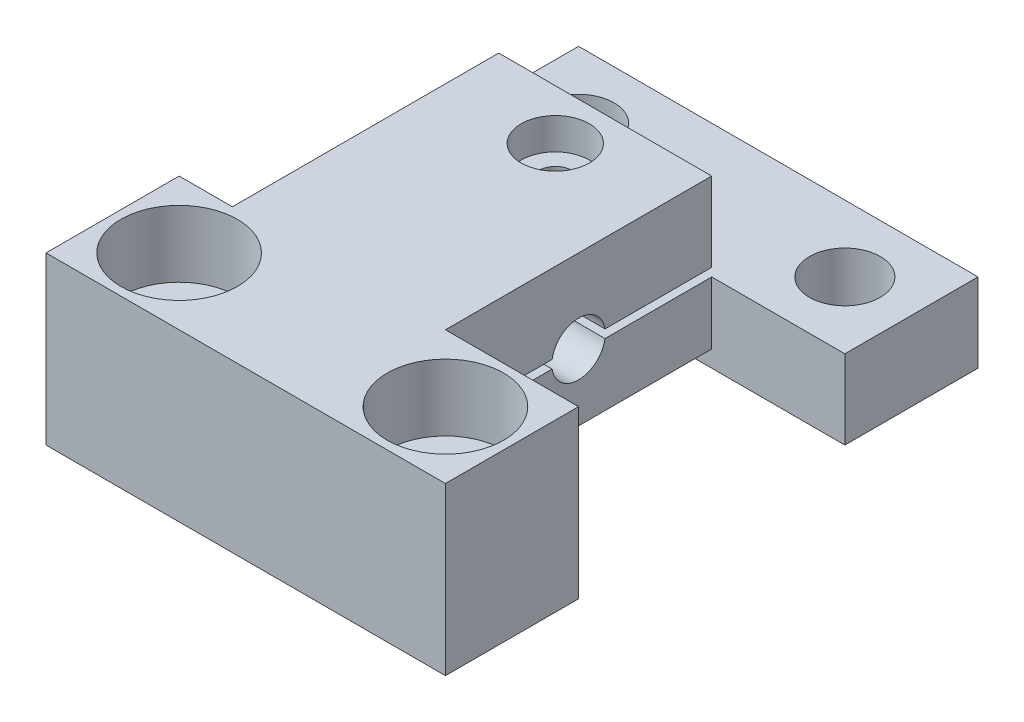
ISO-10303-21;
HEADER;
FILE_DESCRIPTION(('STEP AP214'),'2;1');
FILE_NAME('part.step','',(''),(''),'','','');
FILE_SCHEMA(('AUTOMOTIVE_DESIGN { 1 0 10303 214 1 1 1 1 }'));
ENDSEC;
DATA;
#1=APPLICATION_CONTEXT('core data for automotive mechanical design processes');
#2=APPLICATION_PROTOCOL_DEFINITION('international standard','automotive_design',2000,#1);
#3=PRODUCT_CONTEXT('',#1,'mechanical');
#4=PRODUCT('Part','Part','',(#3));
#5=PRODUCT_RELATED_PRODUCT_CATEGORY('part','',(#4));
#6=PRODUCT_DEFINITION_FORMATION('','',#4);
#7=PRODUCT_DEFINITION_CONTEXT('part definition',#1,'design');
#8=PRODUCT_DEFINITION('design','',#6,#7);
#9=PRODUCT_DEFINITION_SHAPE('','',#8);
#10=(LENGTH_UNIT() NAMED_UNIT(*) SI_UNIT(.MILLI.,.METRE.));
#11=(NAMED_UNIT(*) PLANE_ANGLE_UNIT() SI_UNIT($,.RADIAN.));
#12=(NAMED_UNIT(*) SI_UNIT($,.STERADIAN.) SOLID_ANGLE_UNIT());
#13=UNCERTAINTY_MEASURE_WITH_UNIT(LENGTH_MEASURE(1.E-05),#10,'distance_accuracy_value','');
#14=(GEOMETRIC_REPRESENTATION_CONTEXT(3) GLOBAL_UNCERTAINTY_ASSIGNED_CONTEXT((#13)) GLOBAL_UNIT_ASSIGNED_CONTEXT((#10,
#11,#12)) REPRESENTATION_CONTEXT('',''));
#15=CARTESIAN_POINT('',(0.,0.,0.));
#16=DIRECTION('',(0.,0.,1.));
#17=DIRECTION('',(1.,0.,0.));
#18=AXIS2_PLACEMENT_3D('',#15,#16,#17);
#19=CARTESIAN_POINT('',(-13.97,0.,-12.7));
#20=DIRECTION('',(1.,0.,0.));
#21=DIRECTION('',(0.,0.,-1.));
#22=AXIS2_PLACEMENT_3D('',#19,#20,#21);
#23=PLANE('',#22);
#24=DIRECTION('',(0.,0.,1.));
#25=VECTOR('',#24,1.);
#26=CARTESIAN_POINT('',(-13.97,7.540625,-12.7));
#27=LINE('',#26,#25);
#28=CARTESIAN_POINT('',(-13.97,7.540625,-12.7));
#29=VERTEX_POINT('',#28);
#30=CARTESIAN_POINT('',(-13.97,7.540625,-2.52165967655727));
#31=VERTEX_POINT('',#30);
#32=EDGE_CURVE('E66',#29,#31,#27,.T.);
#33=ORIENTED_EDGE('',*,*,#32,.F.);
#34=DIRECTION('',(0.,1.,0.));
#35=VECTOR('',#34,1.);
#36=CARTESIAN_POINT('',(-13.97,0.,-12.7));
#37=LINE('',#36,#35);
#38=CARTESIAN_POINT('',(-13.97,1.5875,-12.7));
#39=VERTEX_POINT('',#38);
#40=EDGE_CURVE('E372',#39,#29,#37,.T.);
#41=ORIENTED_EDGE('',*,*,#40,.F.);
#42=DIRECTION('',(0.,0.,-1.));
#43=VECTOR('',#42,1.);
#44=CARTESIAN_POINT('',(-13.97,1.5875,12.7));
#45=LINE('',#44,#43);
#46=CARTESIAN_POINT('',(-13.97,1.5875,12.7));
#47=VERTEX_POINT('',#46);
#48=EDGE_CURVE('E317',#47,#39,#45,.T.);
#49=ORIENTED_EDGE('',*,*,#48,.F.);
#50=DIRECTION('',(0.,1.,0.));
#51=VECTOR('',#50,1.);
#52=CARTESIAN_POINT('',(-13.97,0.,12.7));
#53=LINE('',#52,#51);
#54=CARTESIAN_POINT('',(-13.97,15.875,12.7));
#55=VERTEX_POINT('',#54);
#56=EDGE_CURVE('E377',#47,#55,#53,.T.);
#57=ORIENTED_EDGE('',*,*,#56,.T.);
#58=DIRECTION('',(0.,0.,-1.));
#59=VECTOR('',#58,1.);
#60=CARTESIAN_POINT('',(-13.97,15.875,-12.7));
#61=LINE('',#60,#59);
#62=CARTESIAN_POINT('',(-13.97,15.875,-12.7));
#63=VERTEX_POINT('',#62);
#64=EDGE_CURVE('E358',#55,#63,#61,.T.);
#65=ORIENTED_EDGE('',*,*,#64,.T.);
#66=CARTESIAN_POINT('',(-13.97,8.33437499999999,-12.7));
#67=VERTEX_POINT('',#66);
#68=EDGE_CURVE('E376',#67,#63,#37,.T.);
#69=ORIENTED_EDGE('',*,*,#68,.F.);
#70=DIRECTION('',(0.,0.,1.));
#71=VECTOR('',#70,1.);
#72=CARTESIAN_POINT('',(-13.97,8.33437499999999,-12.7));
#73=LINE('',#72,#71);
#74=CARTESIAN_POINT('',(-13.97,8.334375,-2.52165967655728));
#75=VERTEX_POINT('',#74);
#76=EDGE_CURVE('E284',#67,#75,#73,.T.);
#77=ORIENTED_EDGE('',*,*,#76,.T.);
#78=CARTESIAN_POINT('',(-13.97,7.9375,0.));
#79=DIRECTION('',(-1.,0.,0.));
#80=DIRECTION('',(0.,0.,1.));
#81=AXIS2_PLACEMENT_3D('',#78,#79,#80);
#82=CIRCLE('',#81,2.55269999999999);
#83=CARTESIAN_POINT('',(-13.97,8.334375,2.52165967655727));
#84=VERTEX_POINT('',#83);
#85=EDGE_CURVE('E308',#84,#75,#82,.T.);
#86=ORIENTED_EDGE('',*,*,#85,.F.);
#87=CARTESIAN_POINT('',(-13.97,8.334375,6.35));
#88=VERTEX_POINT('',#87);
#89=EDGE_CURVE('E280',#84,#88,#73,.T.);
#90=ORIENTED_EDGE('',*,*,#89,.T.);
#91=DIRECTION('',(0.,1.,0.));
#92=VECTOR('',#91,1.);
#93=CARTESIAN_POINT('',(-13.97,0.,6.35));
#94=LINE('',#93,#92);
#95=CARTESIAN_POINT('',(-13.97,7.540625,6.35));
#96=VERTEX_POINT('',#95);
#97=EDGE_CURVE('E304',#96,#88,#94,.T.);
#98=ORIENTED_EDGE('',*,*,#97,.F.);
#99=CARTESIAN_POINT('',(-13.97,7.540625,2.52165967655728));
#100=VERTEX_POINT('',#99);
#101=EDGE_CURVE('E288',#100,#96,#27,.T.);
#102=ORIENTED_EDGE('',*,*,#101,.F.);
#103=EDGE_CURVE('E307',#31,#100,#82,.T.);
#104=ORIENTED_EDGE('',*,*,#103,.F.);
#105=EDGE_LOOP('',(#33,#41,#49,#57,#65,#69,#77,#86,#90,#98,#102,#104));
#106=FACE_BOUND('',#105,.T.);
#107=ADVANCED_FACE('F40',(#106),#23,.F.);
#108=CARTESIAN_POINT('',(6.35,0.,-12.7));
#109=DIRECTION('',(-1.,0.,0.));
#110=DIRECTION('',(0.,0.,1.));
#111=AXIS2_PLACEMENT_3D('',#108,#109,#110);
#112=PLANE('',#111);
#113=DIRECTION('',(0.,0.,-1.));
#114=VECTOR('',#113,1.);
#115=CARTESIAN_POINT('',(6.35,7.540625,-12.7));
#116=LINE('',#115,#114);
#117=CARTESIAN_POINT('',(6.35,7.540625,-2.52165967655728));
#118=VERTEX_POINT('',#117);
#119=CARTESIAN_POINT('',(6.35,7.540625,-12.7));
#120=VERTEX_POINT('',#119);
#121=EDGE_CURVE('E289',#118,#120,#116,.T.);
#122=ORIENTED_EDGE('',*,*,#121,.F.);
#123=CARTESIAN_POINT('',(6.35,7.9375,0.));
#124=DIRECTION('',(-1.,0.,0.));
#125=DIRECTION('',(0.,0.,1.));
#126=AXIS2_PLACEMENT_3D('',#123,#124,#125);
#127=CIRCLE('',#126,2.55269999999999);
#128=CARTESIAN_POINT('',(6.35,7.540625,2.52165967655727));
#129=VERTEX_POINT('',#128);
#130=EDGE_CURVE('E312',#118,#129,#127,.T.);
#131=ORIENTED_EDGE('',*,*,#130,.T.);
#132=CARTESIAN_POINT('',(6.35,7.540625,6.35));
#133=VERTEX_POINT('',#132);
#134=EDGE_CURVE('E285',#133,#129,#116,.T.);
#135=ORIENTED_EDGE('',*,*,#134,.F.);
#136=DIRECTION('',(0.,-1.,0.));
#137=VECTOR('',#136,1.);
#138=CARTESIAN_POINT('',(6.35,0.,6.35));
#139=LINE('',#138,#137);
#140=CARTESIAN_POINT('',(6.35,8.334375,6.35));
#141=VERTEX_POINT('',#140);
#142=EDGE_CURVE('E11',#141,#133,#139,.T.);
#143=ORIENTED_EDGE('',*,*,#142,.F.);
#144=DIRECTION('',(0.,0.,-1.));
#145=VECTOR('',#144,1.);
#146=CARTESIAN_POINT('',(6.35,8.33437499999999,-12.7));
#147=LINE('',#146,#145);
#148=CARTESIAN_POINT('',(6.35,8.334375,2.52165967655727));
#149=VERTEX_POINT('',#148);
#150=EDGE_CURVE('E276',#141,#149,#147,.T.);
#151=ORIENTED_EDGE('',*,*,#150,.T.);
#152=CARTESIAN_POINT('',(6.35,8.334375,-2.52165967655728));
#153=VERTEX_POINT('',#152);
#154=EDGE_CURVE('E313',#149,#153,#127,.T.);
#155=ORIENTED_EDGE('',*,*,#154,.T.);
#156=CARTESIAN_POINT('',(6.35,8.33437499999999,-12.7));
#157=VERTEX_POINT('',#156);
#158=EDGE_CURVE('E58',#153,#157,#147,.T.);
#159=ORIENTED_EDGE('',*,*,#158,.T.);
#160=DIRECTION('',(0.,1.,0.));
#161=VECTOR('',#160,1.);
#162=CARTESIAN_POINT('',(6.35,0.,-12.7));
#163=LINE('',#162,#161);
#164=CARTESIAN_POINT('',(6.35,15.875,-12.7));
#165=VERTEX_POINT('',#164);
#166=EDGE_CURVE('E350',#157,#165,#163,.T.);
#167=ORIENTED_EDGE('',*,*,#166,.T.);
#168=DIRECTION('',(0.,0.,1.));
#169=VECTOR('',#168,1.);
#170=CARTESIAN_POINT('',(6.35,15.875,-12.7));
#171=LINE('',#170,#169);
#172=CARTESIAN_POINT('',(6.35,15.875,12.7));
#173=VERTEX_POINT('',#172);
#174=EDGE_CURVE('E330',#165,#173,#171,.T.);
#175=ORIENTED_EDGE('',*,*,#174,.T.);
#176=DIRECTION('',(0.,1.,0.));
#177=VECTOR('',#176,1.);
#178=CARTESIAN_POINT('',(6.35,0.,12.7));
#179=LINE('',#178,#177);
#180=CARTESIAN_POINT('',(6.35,1.5875,12.7));
#181=VERTEX_POINT('',#180);
#182=EDGE_CURVE('E343',#181,#173,#179,.T.);
#183=ORIENTED_EDGE('',*,*,#182,.F.);
#184=DIRECTION('',(0.,0.,1.));
#185=VECTOR('',#184,1.);
#186=CARTESIAN_POINT('',(6.35,1.5875,12.7));
#187=LINE('',#186,#185);
#188=CARTESIAN_POINT('',(6.35,1.5875,-12.7));
#189=VERTEX_POINT('',#188);
#190=EDGE_CURVE('E324',#189,#181,#187,.T.);
#191=ORIENTED_EDGE('',*,*,#190,.F.);
#192=EDGE_CURVE('E346',#189,#120,#163,.T.);
#193=ORIENTED_EDGE('',*,*,#192,.T.);
#194=EDGE_LOOP('',(#122,#131,#135,#143,#151,#155,#159,#167,#175,#183,#191,#193));
#195=FACE_BOUND('',#194,.T.);
#196=ADVANCED_FACE('F460',(#195),#112,.F.);
#197=CARTESIAN_POINT('',(-19.05,15.875,-25.4));
#198=DIRECTION('',(1.,0.,0.));
#199=DIRECTION('',(0.,0.,-1.));
#200=AXIS2_PLACEMENT_3D('',#197,#198,#199);
#201=PLANE('',#200);
#202=DIRECTION('',(0.,0.,1.));
#203=VECTOR('',#202,1.);
#204=CARTESIAN_POINT('',(-19.05,7.540625,-25.4));
#205=LINE('',#204,#203);
#206=CARTESIAN_POINT('',(-19.05,7.540625,-25.4));
#207=VERTEX_POINT('',#206);
#208=CARTESIAN_POINT('',(-19.05,7.540625,-12.7));
#209=VERTEX_POINT('',#208);
#210=EDGE_CURVE('E182',#207,#209,#205,.T.);
#211=ORIENTED_EDGE('',*,*,#210,.F.);
#212=DIRECTION('',(0.,-1.,0.));
#213=VECTOR('',#212,1.);
#214=CARTESIAN_POINT('',(-19.05,15.875,-25.4));
#215=LINE('',#214,#213);
#216=CARTESIAN_POINT('',(-19.05,0.,-25.4));
#217=VERTEX_POINT('',#216);
#218=EDGE_CURVE('E196',#207,#217,#215,.T.);
#219=ORIENTED_EDGE('',*,*,#218,.T.);
#220=DIRECTION('',(0.,0.,1.));
#221=VECTOR('',#220,1.);
#222=CARTESIAN_POINT('',(-19.05,0.,-25.4));
#223=LINE('',#222,#221);
#224=CARTESIAN_POINT('',(-19.05,0.,-12.7));
#225=VERTEX_POINT('',#224);
#226=EDGE_CURVE('E427',#217,#225,#223,.T.);
#227=ORIENTED_EDGE('',*,*,#226,.T.);
#228=DIRECTION('',(0.,1.,0.));
#229=VECTOR('',#228,1.);
#230=CARTESIAN_POINT('',(-19.05,0.,-12.7));
#231=LINE('',#230,#229);
#232=EDGE_CURVE('E198',#225,#209,#231,.T.);
#233=ORIENTED_EDGE('',*,*,#232,.T.);
#234=EDGE_LOOP('',(#211,#219,#227,#233));
#235=FACE_BOUND('',#234,.T.);
#236=ADVANCED_FACE('F194',(#235),#201,.F.);
#237=CARTESIAN_POINT('',(19.05,15.875,-25.4));
#238=DIRECTION('',(-1.,0.,0.));
#239=DIRECTION('',(0.,0.,1.));
#240=AXIS2_PLACEMENT_3D('',#237,#238,#239);
#241=PLANE('',#240);
#242=DIRECTION('',(0.,0.,1.));
#243=VECTOR('',#242,1.);
#244=CARTESIAN_POINT('',(19.05,7.540625,-25.4));
#245=LINE('',#244,#243);
#246=CARTESIAN_POINT('',(19.05,7.540625,-25.4));
#247=VERTEX_POINT('',#246);
#248=CARTESIAN_POINT('',(19.05,7.540625,-12.7));
#249=VERTEX_POINT('',#248);
#250=EDGE_CURVE('E185',#247,#249,#245,.T.);
#251=ORIENTED_EDGE('',*,*,#250,.T.);
#252=DIRECTION('',(0.,1.,0.));
#253=VECTOR('',#252,1.);
#254=CARTESIAN_POINT('',(19.05,0.,-12.7));
#255=LINE('',#254,#253);
#256=CARTESIAN_POINT('',(19.05,0.,-12.7));
#257=VERTEX_POINT('',#256);
#258=EDGE_CURVE('E337',#257,#249,#255,.T.);
#259=ORIENTED_EDGE('',*,*,#258,.F.);
#260=DIRECTION('',(0.,0.,-1.));
#261=VECTOR('',#260,1.);
#262=CARTESIAN_POINT('',(19.05,0.,-25.4));
#263=LINE('',#262,#261);
#264=CARTESIAN_POINT('',(19.05,0.,-25.4));
#265=VERTEX_POINT('',#264);
#266=EDGE_CURVE('E432',#257,#265,#263,.T.);
#267=ORIENTED_EDGE('',*,*,#266,.T.);
#268=DIRECTION('',(0.,-1.,0.));
#269=VECTOR('',#268,1.);
#270=CARTESIAN_POINT('',(19.05,15.875,-25.4));
#271=LINE('',#270,#269);
#272=EDGE_CURVE('E206',#247,#265,#271,.T.);
#273=ORIENTED_EDGE('',*,*,#272,.F.);
#274=EDGE_LOOP('',(#251,#259,#267,#273));
#275=FACE_BOUND('',#274,.T.);
#276=ADVANCED_FACE('F444',(#275),#241,.F.);
#277=CARTESIAN_POINT('',(-19.05,15.875,-25.4));
#278=DIRECTION('',(0.,0.,1.));
#279=DIRECTION('',(1.,0.,0.));
#280=AXIS2_PLACEMENT_3D('',#277,#278,#279);
#281=PLANE('',#280);
#282=DIRECTION('',(1.,0.,0.));
#283=VECTOR('',#282,1.);
#284=CARTESIAN_POINT('',(-19.05,7.540625,-25.4));
#285=LINE('',#284,#283);
#286=EDGE_CURVE('E178',#207,#247,#285,.T.);
#287=ORIENTED_EDGE('',*,*,#286,.T.);
#288=ORIENTED_EDGE('',*,*,#272,.T.);
#289=DIRECTION('',(-1.,0.,0.));
#290=VECTOR('',#289,1.);
#291=CARTESIAN_POINT('',(-19.05,0.,-25.4));
#292=LINE('',#291,#290);
#293=EDGE_CURVE('E203',#265,#217,#292,.T.);
#294=ORIENTED_EDGE('',*,*,#293,.T.);
#295=ORIENTED_EDGE('',*,*,#218,.F.);
#296=EDGE_LOOP('',(#287,#288,#294,#295));
#297=FACE_BOUND('',#296,.T.);
#298=ADVANCED_FACE('F201',(#297),#281,.F.);
#299=CARTESIAN_POINT('',(12.7,15.875,-19.05));
#300=DIRECTION('',(0.,1.,0.));
#301=DIRECTION('',(0.,0.,1.));
#302=AXIS2_PLACEMENT_3D('',#299,#300,#301);
#303=CYLINDRICAL_SURFACE('',#302,3.3782);
#304=CARTESIAN_POINT('',(12.7,0.,-19.05));
#305=DIRECTION('',(0.,1.,0.));
#306=DIRECTION('',(0.,0.,1.));
#307=AXIS2_PLACEMENT_3D('',#304,#305,#306);
#308=CIRCLE('',#307,3.37819999999999);
#309=CARTESIAN_POINT('',(12.7,0.,-15.6718));
#310=VERTEX_POINT('',#309);
#311=EDGE_CURVE('E385',#310,#310,#308,.T.);
#312=ORIENTED_EDGE('',*,*,#311,.F.);
#313=EDGE_LOOP('',(#312));
#314=FACE_BOUND('',#313,.T.);
#315=CARTESIAN_POINT('',(12.7,7.540625,-19.05));
#316=DIRECTION('',(0.,1.,0.));
#317=DIRECTION('',(0.,0.,1.));
#318=AXIS2_PLACEMENT_3D('',#315,#316,#317);
#319=CIRCLE('',#318,3.3782);
#320=CARTESIAN_POINT('',(12.7,7.540625,-15.6718));
#321=VERTEX_POINT('',#320);
#322=EDGE_CURVE('E300',#321,#321,#319,.F.);
#323=ORIENTED_EDGE('',*,*,#322,.F.);
#324=EDGE_LOOP('',(#323));
#325=FACE_BOUND('',#324,.T.);
#326=ADVANCED_FACE('F538',(#314,#325),#303,.F.);
#327=CARTESIAN_POINT('',(-12.7,15.875,-19.05));
#328=DIRECTION('',(0.,1.,0.));
#329=DIRECTION('',(0.,0.,1.));
#330=AXIS2_PLACEMENT_3D('',#327,#328,#329);
#331=CYLINDRICAL_SURFACE('',#330,3.3782);
#332=CARTESIAN_POINT('',(-12.7,0.,-19.05));
#333=DIRECTION('',(0.,1.,0.));
#334=DIRECTION('',(0.,0.,1.));
#335=AXIS2_PLACEMENT_3D('',#332,#333,#334);
#336=CIRCLE('',#335,3.3782);
#337=CARTESIAN_POINT('',(-12.7,0.,-15.6718));
#338=VERTEX_POINT('',#337);
#339=EDGE_CURVE('E371',#338,#338,#336,.T.);
#340=ORIENTED_EDGE('',*,*,#339,.F.);
#341=EDGE_LOOP('',(#340));
#342=FACE_BOUND('',#341,.T.);
#343=CARTESIAN_POINT('',(-12.7,7.540625,-19.05));
#344=DIRECTION('',(0.,1.,0.));
#345=DIRECTION('',(0.,0.,1.));
#346=AXIS2_PLACEMENT_3D('',#343,#344,#345);
#347=CIRCLE('',#346,3.3782);
#348=CARTESIAN_POINT('',(-12.7,7.540625,-15.6718));
#349=VERTEX_POINT('',#348);
#350=EDGE_CURVE('E296',#349,#349,#347,.F.);
#351=ORIENTED_EDGE('',*,*,#350,.F.);
#352=EDGE_LOOP('',(#351));
#353=FACE_BOUND('',#352,.T.);
#354=ADVANCED_FACE('F535',(#342,#353),#331,.F.);
#355=CARTESIAN_POINT('',(-19.05,0.,-12.7));
#356=DIRECTION('',(0.,0.,-1.));
#357=DIRECTION('',(-1.,0.,0.));
#358=AXIS2_PLACEMENT_3D('',#355,#356,#357);
#359=PLANE('',#358);
#360=DIRECTION('',(1.,0.,0.));
#361=VECTOR('',#360,1.);
#362=CARTESIAN_POINT('',(-19.05,7.540625,-12.7));
#363=LINE('',#362,#361);
#364=EDGE_CURVE('E295',#209,#29,#363,.T.);
#365=ORIENTED_EDGE('',*,*,#364,.F.);
#366=ORIENTED_EDGE('',*,*,#232,.F.);
#367=DIRECTION('',(-1.,0.,0.));
#368=VECTOR('',#367,1.);
#369=CARTESIAN_POINT('',(-19.05,0.,-12.7));
#370=LINE('',#369,#368);
#371=EDGE_CURVE('E357',#257,#225,#370,.T.);
#372=ORIENTED_EDGE('',*,*,#371,.F.);
#373=ORIENTED_EDGE('',*,*,#258,.T.);
#374=EDGE_CURVE('E292',#120,#249,#363,.T.);
#375=ORIENTED_EDGE('',*,*,#374,.F.);
#376=ORIENTED_EDGE('',*,*,#192,.F.);
#377=DIRECTION('',(1.,0.,0.));
#378=VECTOR('',#377,1.);
#379=CARTESIAN_POINT('',(-13.97,1.5875,-12.7));
#380=LINE('',#379,#378);
#381=EDGE_CURVE('E321',#39,#189,#380,.T.);
#382=ORIENTED_EDGE('',*,*,#381,.F.);
#383=ORIENTED_EDGE('',*,*,#40,.T.);
#384=EDGE_LOOP('',(#365,#366,#372,#373,#375,#376,#382,#383));
#385=FACE_BOUND('',#384,.T.);
#386=ADVANCED_FACE('F448',(#385),#359,.F.);
#387=CARTESIAN_POINT('',(-13.97,7.9375,0.));
#388=DIRECTION('',(-1.,0.,0.));
#389=DIRECTION('',(0.,0.,1.));
#390=AXIS2_PLACEMENT_3D('',#387,#388,#389);
#391=CYLINDRICAL_SURFACE('',#390,2.55269999999999);
#392=DIRECTION('',(-1.,0.,0.));
#393=VECTOR('',#392,1.);
#394=CARTESIAN_POINT('',(-13.97,7.540625,-2.52165967655728));
#395=LINE('',#394,#393);
#396=EDGE_CURVE('E50',#31,#118,#395,.F.);
#397=ORIENTED_EDGE('',*,*,#396,.F.);
#398=ORIENTED_EDGE('',*,*,#103,.T.);
#399=DIRECTION('',(-1.,0.,0.));
#400=VECTOR('',#399,1.);
#401=CARTESIAN_POINT('',(-13.97,7.540625,2.52165967655728));
#402=LINE('',#401,#400);
#403=EDGE_CURVE('E233',#129,#100,#402,.T.);
#404=ORIENTED_EDGE('',*,*,#403,.F.);
#405=ORIENTED_EDGE('',*,*,#130,.F.);
#406=EDGE_LOOP('',(#397,#398,#404,#405));
#407=FACE_BOUND('',#406,.T.);
#408=ADVANCED_FACE('F483',(#407),#391,.F.);
#409=CARTESIAN_POINT('',(-19.05,0.,25.4));
#410=DIRECTION('',(0.,1.,0.));
#411=DIRECTION('',(0.,0.,1.));
#412=AXIS2_PLACEMENT_3D('',#409,#410,#411);
#413=PLANE('',#412);
#414=CARTESIAN_POINT('',(-12.7,0.,19.05));
#415=DIRECTION('',(0.,1.,0.));
#416=DIRECTION('',(0.,0.,1.));
#417=AXIS2_PLACEMENT_3D('',#414,#415,#416);
#418=CIRCLE('',#417,3.3782);
#419=CARTESIAN_POINT('',(-12.7,0.,22.4282));
#420=VERTEX_POINT('',#419);
#421=EDGE_CURVE('E417',#420,#420,#418,.T.);
#422=ORIENTED_EDGE('',*,*,#421,.T.);
#423=EDGE_LOOP('',(#422));
#424=FACE_BOUND('',#423,.T.);
#425=CARTESIAN_POINT('',(12.7,0.,19.05));
#426=DIRECTION('',(0.,1.,0.));
#427=DIRECTION('',(0.,0.,1.));
#428=AXIS2_PLACEMENT_3D('',#425,#426,#427);
#429=CIRCLE('',#428,3.37819999999999);
#430=CARTESIAN_POINT('',(12.7,0.,22.4282));
#431=VERTEX_POINT('',#430);
#432=EDGE_CURVE('E401',#431,#431,#429,.T.);
#433=ORIENTED_EDGE('',*,*,#432,.T.);
#434=EDGE_LOOP('',(#433));
#435=FACE_BOUND('',#434,.T.);
#436=DIRECTION('',(1.,0.,0.));
#437=VECTOR('',#436,1.);
#438=CARTESIAN_POINT('',(-19.05,0.,12.7));
#439=LINE('',#438,#437);
#440=CARTESIAN_POINT('',(-19.05,0.,12.7));
#441=VERTEX_POINT('',#440);
#442=CARTESIAN_POINT('',(19.05,0.,12.7));
#443=VERTEX_POINT('',#442);
#444=EDGE_CURVE('E354',#441,#443,#439,.T.);
#445=ORIENTED_EDGE('',*,*,#444,.T.);
#446=CARTESIAN_POINT('',(19.05,0.,25.4));
#447=VERTEX_POINT('',#446);
#448=EDGE_CURVE('E433',#447,#443,#263,.T.);
#449=ORIENTED_EDGE('',*,*,#448,.F.);
#450=DIRECTION('',(1.,0.,0.));
#451=VECTOR('',#450,1.);
#452=CARTESIAN_POINT('',(-19.05,0.,25.4));
#453=LINE('',#452,#451);
#454=CARTESIAN_POINT('',(-19.05,0.,25.4));
#455=VERTEX_POINT('',#454);
#456=EDGE_CURVE('E430',#455,#447,#453,.T.);
#457=ORIENTED_EDGE('',*,*,#456,.F.);
#458=EDGE_CURVE('E421',#441,#455,#223,.T.);
#459=ORIENTED_EDGE('',*,*,#458,.F.);
#460=EDGE_LOOP('',(#445,#449,#457,#459));
#461=FACE_BOUND('',#460,.T.);
#462=ADVANCED_FACE('F573',(#424,#435,#461),#413,.F.);
#463=ORIENTED_EDGE('',*,*,#448,.T.);
#464=DIRECTION('',(0.,1.,0.));
#465=VECTOR('',#464,1.);
#466=CARTESIAN_POINT('',(19.05,0.,12.7));
#467=LINE('',#466,#465);
#468=CARTESIAN_POINT('',(19.05,15.875,12.7));
#469=VERTEX_POINT('',#468);
#470=EDGE_CURVE('E338',#443,#469,#467,.T.);
#471=ORIENTED_EDGE('',*,*,#470,.T.);
#472=DIRECTION('',(0.,0.,-1.));
#473=VECTOR('',#472,1.);
#474=CARTESIAN_POINT('',(19.05,15.875,-25.4));
#475=LINE('',#474,#473);
#476=CARTESIAN_POINT('',(19.05,15.875,25.4));
#477=VERTEX_POINT('',#476);
#478=EDGE_CURVE('E207',#477,#469,#475,.T.);
#479=ORIENTED_EDGE('',*,*,#478,.F.);
#480=DIRECTION('',(0.,-1.,0.));
#481=VECTOR('',#480,1.);
#482=CARTESIAN_POINT('',(19.05,15.875,25.4));
#483=LINE('',#482,#481);
#484=EDGE_CURVE('E211',#477,#447,#483,.T.);
#485=ORIENTED_EDGE('',*,*,#484,.T.);
#486=EDGE_LOOP('',(#463,#471,#479,#485));
#487=FACE_BOUND('',#486,.T.);
#488=ADVANCED_FACE('F577',(#487),#241,.F.);
#489=DIRECTION('',(0.,0.,1.));
#490=VECTOR('',#489,1.);
#491=CARTESIAN_POINT('',(-19.05,15.875,-25.4));
#492=LINE('',#491,#490);
#493=CARTESIAN_POINT('',(-19.05,15.875,12.7));
#494=VERTEX_POINT('',#493);
#495=CARTESIAN_POINT('',(-19.05,15.875,25.4));
#496=VERTEX_POINT('',#495);
#497=EDGE_CURVE('E422',#494,#496,#492,.T.);
#498=ORIENTED_EDGE('',*,*,#497,.F.);
#499=DIRECTION('',(0.,1.,0.));
#500=VECTOR('',#499,1.);
#501=CARTESIAN_POINT('',(-19.05,0.,12.7));
#502=LINE('',#501,#500);
#503=EDGE_CURVE('E362',#441,#494,#502,.T.);
#504=ORIENTED_EDGE('',*,*,#503,.F.);
#505=ORIENTED_EDGE('',*,*,#458,.T.);
#506=DIRECTION('',(0.,-1.,0.));
#507=VECTOR('',#506,1.);
#508=CARTESIAN_POINT('',(-19.05,15.875,25.4));
#509=LINE('',#508,#507);
#510=EDGE_CURVE('E222',#496,#455,#509,.T.);
#511=ORIENTED_EDGE('',*,*,#510,.F.);
#512=EDGE_LOOP('',(#498,#504,#505,#511));
#513=FACE_BOUND('',#512,.T.);
#514=ADVANCED_FACE('F42',(#513),#201,.F.);
#515=CARTESIAN_POINT('',(-19.05,15.875,25.4));
#516=DIRECTION('',(0.,0.,-1.));
#517=DIRECTION('',(-1.,0.,0.));
#518=AXIS2_PLACEMENT_3D('',#515,#516,#517);
#519=PLANE('',#518);
#520=ORIENTED_EDGE('',*,*,#456,.T.);
#521=ORIENTED_EDGE('',*,*,#484,.F.);
#522=DIRECTION('',(1.,0.,0.));
#523=VECTOR('',#522,1.);
#524=CARTESIAN_POINT('',(-19.05,15.875,25.4));
#525=LINE('',#524,#523);
#526=EDGE_CURVE('E214',#496,#477,#525,.T.);
#527=ORIENTED_EDGE('',*,*,#526,.F.);
#528=ORIENTED_EDGE('',*,*,#510,.T.);
#529=EDGE_LOOP('',(#520,#521,#527,#528));
#530=FACE_BOUND('',#529,.T.);
#531=ADVANCED_FACE('F568',(#530),#519,.F.);
#532=CARTESIAN_POINT('',(-19.05,15.875,25.4));
#533=DIRECTION('',(0.,1.,0.));
#534=DIRECTION('',(0.,0.,1.));
#535=AXIS2_PLACEMENT_3D('',#532,#533,#534);
#536=PLANE('',#535);
#537=CARTESIAN_POINT('',(-3.81000000000001,15.875,-7.9375));
#538=DIRECTION('',(0.,1.,0.));
#539=DIRECTION('',(0.,0.,1.));
#540=AXIS2_PLACEMENT_3D('',#537,#538,#539);
#541=CIRCLE('',#540,3.25);
#542=CARTESIAN_POINT('',(-3.81000000000001,15.875,-4.6875));
#543=VERTEX_POINT('',#542);
#544=EDGE_CURVE('E240',#543,#543,#541,.T.);
#545=ORIENTED_EDGE('',*,*,#544,.F.);
#546=EDGE_LOOP('',(#545));
#547=FACE_BOUND('',#546,.T.);
#548=DIRECTION('',(1.,0.,0.));
#549=VECTOR('',#548,1.);
#550=CARTESIAN_POINT('',(-19.05,15.875,-12.7));
#551=LINE('',#550,#549);
#552=EDGE_CURVE('E190',#63,#165,#551,.T.);
#553=ORIENTED_EDGE('',*,*,#552,.F.);
#554=ORIENTED_EDGE('',*,*,#64,.F.);
#555=DIRECTION('',(1.,0.,0.));
#556=VECTOR('',#555,1.);
#557=CARTESIAN_POINT('',(-19.05,15.875,12.7));
#558=LINE('',#557,#556);
#559=EDGE_CURVE('E342',#494,#55,#558,.T.);
#560=ORIENTED_EDGE('',*,*,#559,.F.);
#561=ORIENTED_EDGE('',*,*,#497,.T.);
#562=ORIENTED_EDGE('',*,*,#526,.T.);
#563=ORIENTED_EDGE('',*,*,#478,.T.);
#564=DIRECTION('',(1.,0.,0.));
#565=VECTOR('',#564,1.);
#566=CARTESIAN_POINT('',(19.05,15.875,12.7));
#567=LINE('',#566,#565);
#568=EDGE_CURVE('E334',#173,#469,#567,.T.);
#569=ORIENTED_EDGE('',*,*,#568,.F.);
#570=ORIENTED_EDGE('',*,*,#174,.F.);
#571=EDGE_LOOP('',(#553,#554,#560,#561,#562,#563,#569,#570));
#572=FACE_BOUND('',#571,.T.);
#573=CARTESIAN_POINT('',(12.7,15.875,19.05));
#574=DIRECTION('',(0.,1.,0.));
#575=DIRECTION('',(0.,0.,1.));
#576=AXIS2_PLACEMENT_3D('',#573,#574,#575);
#577=CIRCLE('',#576,5.55625);
#578=CARTESIAN_POINT('',(12.7,15.875,24.60625));
#579=VERTEX_POINT('',#578);
#580=EDGE_CURVE('E389',#579,#579,#577,.T.);
#581=ORIENTED_EDGE('',*,*,#580,.F.);
#582=EDGE_LOOP('',(#581));
#583=FACE_BOUND('',#582,.T.);
#584=CARTESIAN_POINT('',(-12.7,15.875,19.05));
#585=DIRECTION('',(0.,1.,0.));
#586=DIRECTION('',(0.,0.,1.));
#587=AXIS2_PLACEMENT_3D('',#584,#585,#586);
#588=CIRCLE('',#587,5.55625);
#589=CARTESIAN_POINT('',(-12.7,15.875,24.60625));
#590=VERTEX_POINT('',#589);
#591=EDGE_CURVE('E405',#590,#590,#588,.T.);
#592=ORIENTED_EDGE('',*,*,#591,.F.);
#593=EDGE_LOOP('',(#592));
#594=FACE_BOUND('',#593,.T.);
#595=ADVANCED_FACE('F508',(#547,#572,#583,#594),#536,.T.);
#596=ORIENTED_EDGE('',*,*,#339,.T.);
#597=EDGE_LOOP('',(#596));
#598=FACE_BOUND('',#597,.T.);
#599=ORIENTED_EDGE('',*,*,#311,.T.);
#600=EDGE_LOOP('',(#599));
#601=FACE_BOUND('',#600,.T.);
#602=ORIENTED_EDGE('',*,*,#266,.F.);
#603=ORIENTED_EDGE('',*,*,#371,.T.);
#604=ORIENTED_EDGE('',*,*,#226,.F.);
#605=ORIENTED_EDGE('',*,*,#293,.F.);
#606=EDGE_LOOP('',(#602,#603,#604,#605));
#607=FACE_BOUND('',#606,.T.);
#608=ADVANCED_FACE('F446',(#598,#601,#607),#413,.F.);
#609=CARTESIAN_POINT('',(-12.7,15.875,19.05));
#610=DIRECTION('',(0.,1.,0.));
#611=DIRECTION('',(0.,0.,1.));
#612=AXIS2_PLACEMENT_3D('',#609,#610,#611);
#613=CYLINDRICAL_SURFACE('',#612,3.3782);
#614=ORIENTED_EDGE('',*,*,#421,.F.);
#615=EDGE_LOOP('',(#614));
#616=FACE_BOUND('',#615,.T.);
#617=CARTESIAN_POINT('',(-12.7,9.525,19.05));
#618=DIRECTION('',(0.,1.,0.));
#619=DIRECTION('',(0.,0.,1.));
#620=AXIS2_PLACEMENT_3D('',#617,#618,#619);
#621=CIRCLE('',#620,3.3782);
#622=CARTESIAN_POINT('',(-12.7,9.525,22.4282));
#623=VERTEX_POINT('',#622);
#624=EDGE_CURVE('E413',#623,#623,#621,.T.);
#625=ORIENTED_EDGE('',*,*,#624,.T.);
#626=EDGE_LOOP('',(#625));
#627=FACE_BOUND('',#626,.T.);
#628=ADVANCED_FACE('F561',(#616,#627),#613,.F.);
#629=CARTESIAN_POINT('',(-9.3218,9.525,19.05));
#630=DIRECTION('',(0.,-1.,0.));
#631=DIRECTION('',(0.,0.,-1.));
#632=AXIS2_PLACEMENT_3D('',#629,#630,#631);
#633=PLANE('',#632);
#634=ORIENTED_EDGE('',*,*,#624,.F.);
#635=EDGE_LOOP('',(#634));
#636=FACE_BOUND('',#635,.T.);
#637=CARTESIAN_POINT('',(-12.7,9.525,19.05));
#638=DIRECTION('',(0.,1.,0.));
#639=DIRECTION('',(0.,0.,1.));
#640=AXIS2_PLACEMENT_3D('',#637,#638,#639);
#641=CIRCLE('',#640,5.55625);
#642=CARTESIAN_POINT('',(-12.7,9.525,24.60625));
#643=VERTEX_POINT('',#642);
#644=EDGE_CURVE('E409',#643,#643,#641,.T.);
#645=ORIENTED_EDGE('',*,*,#644,.T.);
#646=EDGE_LOOP('',(#645));
#647=FACE_BOUND('',#646,.T.);
#648=ADVANCED_FACE('F557',(#636,#647),#633,.F.);
#649=CARTESIAN_POINT('',(-12.7,15.875,19.05));
#650=DIRECTION('',(0.,1.,0.));
#651=DIRECTION('',(0.,0.,1.));
#652=AXIS2_PLACEMENT_3D('',#649,#650,#651);
#653=CYLINDRICAL_SURFACE('',#652,5.55625);
#654=ORIENTED_EDGE('',*,*,#644,.F.);
#655=EDGE_LOOP('',(#654));
#656=FACE_BOUND('',#655,.T.);
#657=ORIENTED_EDGE('',*,*,#591,.T.);
#658=EDGE_LOOP('',(#657));
#659=FACE_BOUND('',#658,.T.);
#660=ADVANCED_FACE('F553',(#656,#659),#653,.F.);
#661=CARTESIAN_POINT('',(12.7,15.875,19.05));
#662=DIRECTION('',(0.,1.,0.));
#663=DIRECTION('',(0.,0.,1.));
#664=AXIS2_PLACEMENT_3D('',#661,#662,#663);
#665=CYLINDRICAL_SURFACE('',#664,3.3782);
#666=ORIENTED_EDGE('',*,*,#432,.F.);
#667=EDGE_LOOP('',(#666));
#668=FACE_BOUND('',#667,.T.);
#669=CARTESIAN_POINT('',(12.7,9.525,19.05));
#670=DIRECTION('',(0.,1.,0.));
#671=DIRECTION('',(0.,0.,1.));
#672=AXIS2_PLACEMENT_3D('',#669,#670,#671);
#673=CIRCLE('',#672,3.3782);
#674=CARTESIAN_POINT('',(12.7,9.525,22.4282));
#675=VERTEX_POINT('',#674);
#676=EDGE_CURVE('E397',#675,#675,#673,.T.);
#677=ORIENTED_EDGE('',*,*,#676,.T.);
#678=EDGE_LOOP('',(#677));
#679=FACE_BOUND('',#678,.T.);
#680=ADVANCED_FACE('F549',(#668,#679),#665,.F.);
#681=CARTESIAN_POINT('',(16.0782,9.525,19.05));
#682=DIRECTION('',(0.,-1.,0.));
#683=DIRECTION('',(0.,0.,-1.));
#684=AXIS2_PLACEMENT_3D('',#681,#682,#683);
#685=PLANE('',#684);
#686=ORIENTED_EDGE('',*,*,#676,.F.);
#687=EDGE_LOOP('',(#686));
#688=FACE_BOUND('',#687,.T.);
#689=CARTESIAN_POINT('',(12.7,9.525,19.05));
#690=DIRECTION('',(0.,1.,0.));
#691=DIRECTION('',(0.,0.,1.));
#692=AXIS2_PLACEMENT_3D('',#689,#690,#691);
#693=CIRCLE('',#692,5.55625);
#694=CARTESIAN_POINT('',(12.7,9.525,24.60625));
#695=VERTEX_POINT('',#694);
#696=EDGE_CURVE('E393',#695,#695,#693,.T.);
#697=ORIENTED_EDGE('',*,*,#696,.T.);
#698=EDGE_LOOP('',(#697));
#699=FACE_BOUND('',#698,.T.);
#700=ADVANCED_FACE('F545',(#688,#699),#685,.F.);
#701=CARTESIAN_POINT('',(12.7,15.875,19.05));
#702=DIRECTION('',(0.,1.,0.));
#703=DIRECTION('',(0.,0.,1.));
#704=AXIS2_PLACEMENT_3D('',#701,#702,#703);
#705=CYLINDRICAL_SURFACE('',#704,5.55625);
#706=ORIENTED_EDGE('',*,*,#696,.F.);
#707=EDGE_LOOP('',(#706));
#708=FACE_BOUND('',#707,.T.);
#709=ORIENTED_EDGE('',*,*,#580,.T.);
#710=EDGE_LOOP('',(#709));
#711=FACE_BOUND('',#710,.T.);
#712=ADVANCED_FACE('F534',(#708,#711),#705,.F.);
#713=CARTESIAN_POINT('',(-19.05,0.,12.7));
#714=DIRECTION('',(0.,0.,1.));
#715=DIRECTION('',(1.,0.,0.));
#716=AXIS2_PLACEMENT_3D('',#713,#714,#715);
#717=PLANE('',#716);
#718=ORIENTED_EDGE('',*,*,#559,.T.);
#719=ORIENTED_EDGE('',*,*,#56,.F.);
#720=DIRECTION('',(-1.,0.,0.));
#721=VECTOR('',#720,1.);
#722=CARTESIAN_POINT('',(-13.97,1.5875,12.7));
#723=LINE('',#722,#721);
#724=EDGE_CURVE('E327',#181,#47,#723,.T.);
#725=ORIENTED_EDGE('',*,*,#724,.F.);
#726=ORIENTED_EDGE('',*,*,#182,.T.);
#727=ORIENTED_EDGE('',*,*,#568,.T.);
#728=ORIENTED_EDGE('',*,*,#470,.F.);
#729=ORIENTED_EDGE('',*,*,#444,.F.);
#730=ORIENTED_EDGE('',*,*,#503,.T.);
#731=EDGE_LOOP('',(#718,#719,#725,#726,#727,#728,#729,#730));
#732=FACE_BOUND('',#731,.T.);
#733=ADVANCED_FACE('F502',(#732),#717,.F.);
#734=CARTESIAN_POINT('',(-13.97,1.5875,-12.7));
#735=DIRECTION('',(0.,-1.,0.));
#736=DIRECTION('',(0.,0.,-1.));
#737=AXIS2_PLACEMENT_3D('',#734,#735,#736);
#738=PLANE('',#737);
#739=CARTESIAN_POINT('',(-3.81000000000001,1.5875,-7.9375));
#740=DIRECTION('',(0.,-1.,0.));
#741=DIRECTION('',(0.,0.,-1.));
#742=AXIS2_PLACEMENT_3D('',#739,#740,#741);
#743=CIRCLE('',#742,1.25);
#744=CARTESIAN_POINT('',(-3.81000000000001,1.5875,-9.1875));
#745=VERTEX_POINT('',#744);
#746=EDGE_CURVE('E246',#745,#745,#743,.T.);
#747=ORIENTED_EDGE('',*,*,#746,.F.);
#748=EDGE_LOOP('',(#747));
#749=FACE_BOUND('',#748,.T.);
#750=ORIENTED_EDGE('',*,*,#48,.T.);
#751=ORIENTED_EDGE('',*,*,#381,.T.);
#752=ORIENTED_EDGE('',*,*,#190,.T.);
#753=ORIENTED_EDGE('',*,*,#724,.T.);
#754=EDGE_LOOP('',(#750,#751,#752,#753));
#755=FACE_BOUND('',#754,.T.);
#756=ADVANCED_FACE('F498',(#749,#755),#738,.T.);
#757=ORIENTED_EDGE('',*,*,#85,.T.);
#758=DIRECTION('',(-1.,0.,0.));
#759=VECTOR('',#758,1.);
#760=CARTESIAN_POINT('',(-13.97,8.334375,-2.52165967655728));
#761=LINE('',#760,#759);
#762=EDGE_CURVE('E230',#75,#153,#761,.F.);
#763=ORIENTED_EDGE('',*,*,#762,.T.);
#764=ORIENTED_EDGE('',*,*,#154,.F.);
#765=DIRECTION('',(-1.,0.,0.));
#766=VECTOR('',#765,1.);
#767=CARTESIAN_POINT('',(-13.97,8.334375,2.52165967655728));
#768=LINE('',#767,#766);
#769=EDGE_CURVE('E226',#149,#84,#768,.T.);
#770=ORIENTED_EDGE('',*,*,#769,.T.);
#771=EDGE_LOOP('',(#757,#763,#764,#770));
#772=FACE_BOUND('',#771,.T.);
#773=ADVANCED_FACE('F465',(#772),#391,.F.);
#774=CARTESIAN_POINT('',(-19.05,8.33437499999999,-12.7));
#775=DIRECTION('',(0.,1.,0.));
#776=DIRECTION('',(0.,0.,1.));
#777=AXIS2_PLACEMENT_3D('',#774,#775,#776);
#778=PLANE('',#777);
#779=ORIENTED_EDGE('',*,*,#769,.F.);
#780=ORIENTED_EDGE('',*,*,#150,.F.);
#781=DIRECTION('',(1.,0.,0.));
#782=VECTOR('',#781,1.);
#783=CARTESIAN_POINT('',(-19.05,8.334375,6.35));
#784=LINE('',#783,#782);
#785=EDGE_CURVE('E260',#88,#141,#784,.T.);
#786=ORIENTED_EDGE('',*,*,#785,.F.);
#787=ORIENTED_EDGE('',*,*,#89,.F.);
#788=EDGE_LOOP('',(#779,#780,#786,#787));
#789=FACE_BOUND('',#788,.T.);
#790=ADVANCED_FACE('F522',(#789),#778,.F.);
#791=CARTESIAN_POINT('',(-19.05,7.540625,-25.4));
#792=DIRECTION('',(0.,1.,0.));
#793=DIRECTION('',(0.,0.,1.));
#794=AXIS2_PLACEMENT_3D('',#791,#792,#793);
#795=PLANE('',#794);
#796=ORIENTED_EDGE('',*,*,#101,.T.);
#797=DIRECTION('',(1.,0.,0.));
#798=VECTOR('',#797,1.);
#799=CARTESIAN_POINT('',(-19.05,7.540625,6.35));
#800=LINE('',#799,#798);
#801=EDGE_CURVE('E263',#96,#133,#800,.T.);
#802=ORIENTED_EDGE('',*,*,#801,.T.);
#803=ORIENTED_EDGE('',*,*,#134,.T.);
#804=ORIENTED_EDGE('',*,*,#403,.T.);
#805=EDGE_LOOP('',(#796,#802,#803,#804));
#806=FACE_BOUND('',#805,.T.);
#807=ADVANCED_FACE('F489',(#806),#795,.T.);
#808=CARTESIAN_POINT('',(-19.05,7.540625,6.35));
#809=DIRECTION('',(0.,0.,-1.));
#810=DIRECTION('',(-1.,0.,0.));
#811=AXIS2_PLACEMENT_3D('',#808,#809,#810);
#812=PLANE('',#811);
#813=ORIENTED_EDGE('',*,*,#97,.T.);
#814=ORIENTED_EDGE('',*,*,#785,.T.);
#815=ORIENTED_EDGE('',*,*,#142,.T.);
#816=ORIENTED_EDGE('',*,*,#801,.F.);
#817=EDGE_LOOP('',(#813,#814,#815,#816));
#818=FACE_BOUND('',#817,.T.);
#819=ADVANCED_FACE('F492',(#818),#812,.T.);
#820=CARTESIAN_POINT('',(-3.81000000000001,8.33437499999999,-7.9375));
#821=DIRECTION('',(0.,1.,0.));
#822=DIRECTION('',(0.,0.,1.));
#823=AXIS2_PLACEMENT_3D('',#820,#821,#822);
#824=CIRCLE('',#823,1.55);
#825=CARTESIAN_POINT('',(-3.81000000000001,8.33437499999999,-6.3875));
#826=VERTEX_POINT('',#825);
#827=EDGE_CURVE('E237',#826,#826,#824,.T.);
#828=ORIENTED_EDGE('',*,*,#827,.T.);
#829=EDGE_LOOP('',(#828));
#830=FACE_BOUND('',#829,.T.);
#831=DIRECTION('',(1.,0.,0.));
#832=VECTOR('',#831,1.);
#833=CARTESIAN_POINT('',(-19.05,8.33437499999999,-12.7));
#834=LINE('',#833,#832);
#835=EDGE_CURVE('E267',#67,#157,#834,.T.);
#836=ORIENTED_EDGE('',*,*,#835,.T.);
#837=ORIENTED_EDGE('',*,*,#158,.F.);
#838=ORIENTED_EDGE('',*,*,#762,.F.);
#839=ORIENTED_EDGE('',*,*,#76,.F.);
#840=EDGE_LOOP('',(#836,#837,#838,#839));
#841=FACE_BOUND('',#840,.T.);
#842=ADVANCED_FACE('F467',(#830,#841),#778,.F.);
#843=CARTESIAN_POINT('',(-19.05,15.875,-12.7));
#844=DIRECTION('',(0.,0.,1.));
#845=DIRECTION('',(0.,-1.,0.));
#846=AXIS2_PLACEMENT_3D('',#843,#844,#845);
#847=PLANE('',#846);
#848=ORIENTED_EDGE('',*,*,#552,.T.);
#849=ORIENTED_EDGE('',*,*,#166,.F.);
#850=ORIENTED_EDGE('',*,*,#835,.F.);
#851=ORIENTED_EDGE('',*,*,#68,.T.);
#852=EDGE_LOOP('',(#848,#849,#850,#851));
#853=FACE_BOUND('',#852,.T.);
#854=ADVANCED_FACE('F511',(#853),#847,.F.);
#855=CARTESIAN_POINT('',(-3.81000000000001,7.540625,-7.9375));
#856=DIRECTION('',(0.,1.,0.));
#857=DIRECTION('',(0.,0.,1.));
#858=AXIS2_PLACEMENT_3D('',#855,#856,#857);
#859=CIRCLE('',#858,1.25);
#860=CARTESIAN_POINT('',(-3.81000000000001,7.540625,-6.6875));
#861=VERTEX_POINT('',#860);
#862=EDGE_CURVE('E44',#861,#861,#859,.T.);
#863=ORIENTED_EDGE('',*,*,#862,.F.);
#864=EDGE_LOOP('',(#863));
#865=FACE_BOUND('',#864,.T.);
#866=ORIENTED_EDGE('',*,*,#364,.T.);
#867=ORIENTED_EDGE('',*,*,#32,.T.);
#868=ORIENTED_EDGE('',*,*,#396,.T.);
#869=ORIENTED_EDGE('',*,*,#121,.T.);
#870=ORIENTED_EDGE('',*,*,#374,.T.);
#871=ORIENTED_EDGE('',*,*,#250,.F.);
#872=ORIENTED_EDGE('',*,*,#286,.F.);
#873=ORIENTED_EDGE('',*,*,#210,.T.);
#874=EDGE_LOOP('',(#866,#867,#868,#869,#870,#871,#872,#873));
#875=FACE_BOUND('',#874,.T.);
#876=ORIENTED_EDGE('',*,*,#350,.T.);
#877=EDGE_LOOP('',(#876));
#878=FACE_BOUND('',#877,.T.);
#879=ORIENTED_EDGE('',*,*,#322,.T.);
#880=EDGE_LOOP('',(#879));
#881=FACE_BOUND('',#880,.T.);
#882=ADVANCED_FACE('F180',(#865,#875,#878,#881),#795,.T.);
#883=CARTESIAN_POINT('',(-3.81000000000001,15.875,-7.9375));
#884=DIRECTION('',(0.,1.,0.));
#885=DIRECTION('',(0.,0.,1.));
#886=AXIS2_PLACEMENT_3D('',#883,#884,#885);
#887=CYLINDRICAL_SURFACE('',#886,3.25);
#888=CARTESIAN_POINT('',(-3.81000000000001,12.875,-7.9375));
#889=DIRECTION('',(0.,1.,0.));
#890=DIRECTION('',(0.,0.,1.));
#891=AXIS2_PLACEMENT_3D('',#888,#889,#890);
#892=CIRCLE('',#891,3.25);
#893=CARTESIAN_POINT('',(-3.81000000000001,12.875,-4.6875));
#894=VERTEX_POINT('',#893);
#895=EDGE_CURVE('E248',#894,#894,#892,.T.);
#896=ORIENTED_EDGE('',*,*,#895,.F.);
#897=EDGE_LOOP('',(#896));
#898=FACE_BOUND('',#897,.T.);
#899=ORIENTED_EDGE('',*,*,#544,.T.);
#900=EDGE_LOOP('',(#899));
#901=FACE_BOUND('',#900,.T.);
#902=ADVANCED_FACE('F518',(#898,#901),#887,.F.);
#903=CARTESIAN_POINT('',(-0.560000000000005,12.875,-7.9375));
#904=DIRECTION('',(0.,-1.,0.));
#905=DIRECTION('',(0.,0.,-1.));
#906=AXIS2_PLACEMENT_3D('',#903,#904,#905);
#907=PLANE('',#906);
#908=CARTESIAN_POINT('',(-3.81000000000001,12.875,-7.9375));
#909=DIRECTION('',(0.,1.,0.));
#910=DIRECTION('',(0.,0.,1.));
#911=AXIS2_PLACEMENT_3D('',#908,#909,#910);
#912=CIRCLE('',#911,1.55);
#913=CARTESIAN_POINT('',(-3.81000000000001,12.875,-6.3875));
#914=VERTEX_POINT('',#913);
#915=EDGE_CURVE('E254',#914,#914,#912,.T.);
#916=ORIENTED_EDGE('',*,*,#915,.F.);
#917=EDGE_LOOP('',(#916));
#918=FACE_BOUND('',#917,.T.);
#919=ORIENTED_EDGE('',*,*,#895,.T.);
#920=EDGE_LOOP('',(#919));
#921=FACE_BOUND('',#920,.T.);
#922=ADVANCED_FACE('F640',(#918,#921),#907,.F.);
#923=CARTESIAN_POINT('',(-3.81000000000001,15.875,-7.9375));
#924=DIRECTION('',(0.,1.,0.));
#925=DIRECTION('',(0.,0.,1.));
#926=AXIS2_PLACEMENT_3D('',#923,#924,#925);
#927=CYLINDRICAL_SURFACE('',#926,1.55);
#928=ORIENTED_EDGE('',*,*,#915,.T.);
#929=EDGE_LOOP('',(#928));
#930=FACE_BOUND('',#929,.T.);
#931=ORIENTED_EDGE('',*,*,#827,.F.);
#932=EDGE_LOOP('',(#931));
#933=FACE_BOUND('',#932,.T.);
#934=ADVANCED_FACE('F634',(#930,#933),#927,.F.);
#935=CARTESIAN_POINT('',(-3.81000000000001,15.875,-7.9375));
#936=DIRECTION('',(0.,1.,0.));
#937=DIRECTION('',(0.,0.,1.));
#938=AXIS2_PLACEMENT_3D('',#935,#936,#937);
#939=CYLINDRICAL_SURFACE('',#938,1.25);
#940=ORIENTED_EDGE('',*,*,#746,.T.);
#941=EDGE_LOOP('',(#940));
#942=FACE_BOUND('',#941,.T.);
#943=ORIENTED_EDGE('',*,*,#862,.T.);
#944=EDGE_LOOP('',(#943));
#945=FACE_BOUND('',#944,.T.);
#946=ADVANCED_FACE('F631',(#942,#945),#939,.F.);
#947=CLOSED_SHELL('',(#107,#196,#236,#276,#298,#326,#354,#386,#408,#462,#488,#514,#531,#595,
#608,#628,#648,#660,#680,#700,#712,#733,#756,#773,#790,#807,#819,#842,#854,#882,#902,#922,#934,#946));
#948=MANIFOLD_SOLID_BREP('B2',#947);
#949=ADVANCED_BREP_SHAPE_REPRESENTATION('',(#18,#948),#14);
#950=SHAPE_DEFINITION_REPRESENTATION(#9,#949);
ENDSEC;
END-ISO-10303-21;
